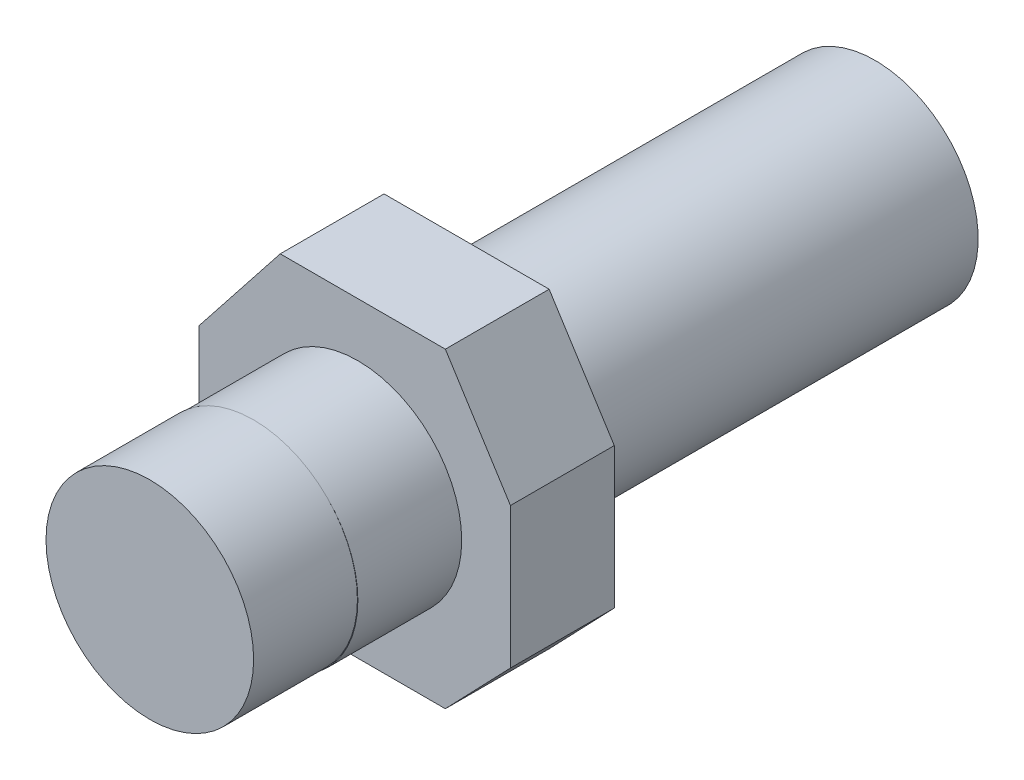
ISO-10303-21;
HEADER;
FILE_DESCRIPTION(('STEP AP214'),'2;1');
FILE_NAME('part.step','',(''),(''),'','','');
FILE_SCHEMA(('AUTOMOTIVE_DESIGN { 1 0 10303 214 1 1 1 1 }'));
ENDSEC;
DATA;
#1=APPLICATION_CONTEXT('core data for automotive mechanical design processes');
#2=APPLICATION_PROTOCOL_DEFINITION('international standard','automotive_design',2000,#1);
#3=PRODUCT_CONTEXT('',#1,'mechanical');
#4=PRODUCT('Part','Part','',(#3));
#5=PRODUCT_RELATED_PRODUCT_CATEGORY('part','',(#4));
#6=PRODUCT_DEFINITION_FORMATION('','',#4);
#7=PRODUCT_DEFINITION_CONTEXT('part definition',#1,'design');
#8=PRODUCT_DEFINITION('design','',#6,#7);
#9=PRODUCT_DEFINITION_SHAPE('','',#8);
#10=(LENGTH_UNIT() NAMED_UNIT(*) SI_UNIT(.MILLI.,.METRE.));
#11=(NAMED_UNIT(*) PLANE_ANGLE_UNIT() SI_UNIT($,.RADIAN.));
#12=(NAMED_UNIT(*) SI_UNIT($,.STERADIAN.) SOLID_ANGLE_UNIT());
#13=UNCERTAINTY_MEASURE_WITH_UNIT(LENGTH_MEASURE(1.E-05),#10,'distance_accuracy_value','');
#14=(GEOMETRIC_REPRESENTATION_CONTEXT(3) GLOBAL_UNCERTAINTY_ASSIGNED_CONTEXT((#13)) GLOBAL_UNIT_ASSIGNED_CONTEXT((#10,
#11,#12)) REPRESENTATION_CONTEXT('',''));
#15=CARTESIAN_POINT('',(0.,0.,0.));
#16=DIRECTION('',(0.,0.,1.));
#17=DIRECTION('',(1.,0.,0.));
#18=AXIS2_PLACEMENT_3D('',#15,#16,#17);
#19=CARTESIAN_POINT('',(-4.6073531721352,6.25797101449275,10.));
#20=DIRECTION('',(0.784882765533426,-0.61964428857902,0.));
#21=DIRECTION('',(0.61964428857902,0.784882765533426,0.));
#22=AXIS2_PLACEMENT_3D('',#19,#20,#21);
#23=PLANE('',#22);
#24=DIRECTION('',(-0.61964428857902,-0.784882765533426,0.));
#25=VECTOR('',#24,1.);
#26=CARTESIAN_POINT('',(-4.6073531721352,6.25797101449275,0.));
#27=LINE('',#26,#25);
#28=CARTESIAN_POINT('',(3.21511059598073,16.1664251207729,0.));
#29=VERTEX_POINT('',#28);
#30=CARTESIAN_POINT('',(-4.6073531721352,6.25797101449275,0.));
#31=VERTEX_POINT('',#30);
#32=EDGE_CURVE('E143',#29,#31,#27,.T.);
#33=ORIENTED_EDGE('',*,*,#32,.T.);
#34=DIRECTION('',(0.,0.,-1.));
#35=VECTOR('',#34,1.);
#36=CARTESIAN_POINT('',(-4.6073531721352,6.25797101449275,10.));
#37=LINE('',#36,#35);
#38=CARTESIAN_POINT('',(-4.6073531721352,6.25797101449275,10.));
#39=VERTEX_POINT('',#38);
#40=EDGE_CURVE('E39',#39,#31,#37,.T.);
#41=ORIENTED_EDGE('',*,*,#40,.F.);
#42=DIRECTION('',(-0.61964428857902,-0.784882765533426,0.));
#43=VECTOR('',#42,1.);
#44=CARTESIAN_POINT('',(-4.6073531721352,6.25797101449275,10.));
#45=LINE('',#44,#43);
#46=CARTESIAN_POINT('',(3.21511059598073,16.1664251207729,10.));
#47=VERTEX_POINT('',#46);
#48=EDGE_CURVE('E159',#47,#39,#45,.T.);
#49=ORIENTED_EDGE('',*,*,#48,.F.);
#50=DIRECTION('',(0.,0.,-1.));
#51=VECTOR('',#50,1.);
#52=CARTESIAN_POINT('',(3.21511059598073,16.1664251207729,10.));
#53=LINE('',#52,#51);
#54=EDGE_CURVE('E139',#47,#29,#53,.T.);
#55=ORIENTED_EDGE('',*,*,#54,.T.);
#56=EDGE_LOOP('',(#33,#41,#49,#55));
#57=FACE_BOUND('',#56,.T.);
#58=ADVANCED_FACE('F36',(#57),#23,.F.);
#59=CARTESIAN_POINT('',(-4.6073531721352,-7.30096618357487,10.));
#60=DIRECTION('',(1.,0.,0.));
#61=DIRECTION('',(0.,0.,-1.));
#62=AXIS2_PLACEMENT_3D('',#59,#60,#61);
#63=PLANE('',#62);
#64=DIRECTION('',(0.,-1.,0.));
#65=VECTOR('',#64,1.);
#66=CARTESIAN_POINT('',(-4.6073531721352,-7.30096618357487,0.));
#67=LINE('',#66,#65);
#68=CARTESIAN_POINT('',(-4.6073531721352,-7.30096618357487,0.));
#69=VERTEX_POINT('',#68);
#70=EDGE_CURVE('E146',#31,#69,#67,.T.);
#71=ORIENTED_EDGE('',*,*,#70,.T.);
#72=DIRECTION('',(0.,0.,-1.));
#73=VECTOR('',#72,1.);
#74=CARTESIAN_POINT('',(-4.6073531721352,-7.30096618357487,10.));
#75=LINE('',#74,#73);
#76=CARTESIAN_POINT('',(-4.6073531721352,-7.30096618357487,10.));
#77=VERTEX_POINT('',#76);
#78=EDGE_CURVE('E168',#77,#69,#75,.T.);
#79=ORIENTED_EDGE('',*,*,#78,.F.);
#80=DIRECTION('',(0.,-1.,0.));
#81=VECTOR('',#80,1.);
#82=CARTESIAN_POINT('',(-4.6073531721352,-7.30096618357487,10.));
#83=LINE('',#82,#81);
#84=EDGE_CURVE('E101',#39,#77,#83,.T.);
#85=ORIENTED_EDGE('',*,*,#84,.F.);
#86=ORIENTED_EDGE('',*,*,#40,.T.);
#87=EDGE_LOOP('',(#71,#79,#85,#86));
#88=FACE_BOUND('',#87,.T.);
#89=ADVANCED_FACE('F203',(#88),#63,.F.);
#90=CARTESIAN_POINT('',(3.21511059598073,-13.8335748792271,10.));
#91=DIRECTION('',(0.64098832210659,0.767550630853092,0.));
#92=DIRECTION('',(-0.767550630853092,0.64098832210659,0.));
#93=AXIS2_PLACEMENT_3D('',#90,#91,#92);
#94=PLANE('',#93);
#95=DIRECTION('',(0.767550630853091,-0.64098832210659,0.));
#96=VECTOR('',#95,1.);
#97=CARTESIAN_POINT('',(3.21511059598073,-13.8335748792271,0.));
#98=LINE('',#97,#96);
#99=CARTESIAN_POINT('',(3.21511059598073,-13.8335748792271,0.));
#100=VERTEX_POINT('',#99);
#101=EDGE_CURVE('E149',#69,#100,#98,.T.);
#102=ORIENTED_EDGE('',*,*,#101,.T.);
#103=DIRECTION('',(0.,0.,-1.));
#104=VECTOR('',#103,1.);
#105=CARTESIAN_POINT('',(3.21511059598073,-13.8335748792271,10.));
#106=LINE('',#105,#104);
#107=CARTESIAN_POINT('',(3.21511059598073,-13.8335748792271,10.));
#108=VERTEX_POINT('',#107);
#109=EDGE_CURVE('E166',#108,#100,#106,.T.);
#110=ORIENTED_EDGE('',*,*,#109,.F.);
#111=DIRECTION('',(0.767550630853091,-0.64098832210659,0.));
#112=VECTOR('',#111,1.);
#113=CARTESIAN_POINT('',(3.21511059598073,-13.8335748792271,10.));
#114=LINE('',#113,#112);
#115=EDGE_CURVE('E185',#77,#108,#114,.T.);
#116=ORIENTED_EDGE('',*,*,#115,.F.);
#117=ORIENTED_EDGE('',*,*,#78,.T.);
#118=EDGE_LOOP('',(#102,#110,#116,#117));
#119=FACE_BOUND('',#118,.T.);
#120=ADVANCED_FACE('F204',(#119),#94,.F.);
#121=CARTESIAN_POINT('',(19.1207869244832,-13.8335748792271,10.));
#122=DIRECTION('',(0.,1.,0.));
#123=DIRECTION('',(0.,0.,1.));
#124=AXIS2_PLACEMENT_3D('',#121,#122,#123);
#125=PLANE('',#124);
#126=DIRECTION('',(1.,0.,0.));
#127=VECTOR('',#126,1.);
#128=CARTESIAN_POINT('',(19.1207869244832,-13.8335748792271,0.));
#129=LINE('',#128,#127);
#130=CARTESIAN_POINT('',(19.1207869244832,-13.8335748792271,0.));
#131=VERTEX_POINT('',#130);
#132=EDGE_CURVE('E151',#100,#131,#129,.T.);
#133=ORIENTED_EDGE('',*,*,#132,.T.);
#134=DIRECTION('',(0.,0.,-1.));
#135=VECTOR('',#134,1.);
#136=CARTESIAN_POINT('',(19.1207869244832,-13.8335748792271,10.));
#137=LINE('',#136,#135);
#138=CARTESIAN_POINT('',(19.1207869244832,-13.8335748792271,10.));
#139=VERTEX_POINT('',#138);
#140=EDGE_CURVE('E163',#139,#131,#137,.T.);
#141=ORIENTED_EDGE('',*,*,#140,.F.);
#142=DIRECTION('',(1.,0.,0.));
#143=VECTOR('',#142,1.);
#144=CARTESIAN_POINT('',(19.1207869244832,-13.8335748792271,10.));
#145=LINE('',#144,#143);
#146=EDGE_CURVE('E187',#108,#139,#145,.T.);
#147=ORIENTED_EDGE('',*,*,#146,.F.);
#148=ORIENTED_EDGE('',*,*,#109,.T.);
#149=EDGE_LOOP('',(#133,#141,#147,#148));
#150=FACE_BOUND('',#149,.T.);
#151=ADVANCED_FACE('F192',(#150),#125,.F.);
#152=CARTESIAN_POINT('',(25.3926468278648,-7.30096618357487,10.));
#153=DIRECTION('',(-0.721356672535713,0.692563752291588,0.));
#154=DIRECTION('',(-0.692563752291588,-0.721356672535713,0.));
#155=AXIS2_PLACEMENT_3D('',#152,#153,#154);
#156=PLANE('',#155);
#157=DIRECTION('',(0.692563752291588,0.721356672535713,0.));
#158=VECTOR('',#157,1.);
#159=CARTESIAN_POINT('',(25.3926468278648,-7.30096618357487,0.));
#160=LINE('',#159,#158);
#161=CARTESIAN_POINT('',(25.3926468278648,-7.30096618357487,0.));
#162=VERTEX_POINT('',#161);
#163=EDGE_CURVE('E153',#131,#162,#160,.T.);
#164=ORIENTED_EDGE('',*,*,#163,.T.);
#165=DIRECTION('',(0.,0.,-1.));
#166=VECTOR('',#165,1.);
#167=CARTESIAN_POINT('',(25.3926468278648,-7.30096618357487,10.));
#168=LINE('',#167,#166);
#169=CARTESIAN_POINT('',(25.3926468278648,-7.30096618357487,10.));
#170=VERTEX_POINT('',#169);
#171=EDGE_CURVE('E134',#170,#162,#168,.T.);
#172=ORIENTED_EDGE('',*,*,#171,.F.);
#173=DIRECTION('',(0.692563752291588,0.721356672535713,0.));
#174=VECTOR('',#173,1.);
#175=CARTESIAN_POINT('',(25.3926468278648,-7.30096618357487,10.));
#176=LINE('',#175,#174);
#177=EDGE_CURVE('E122',#139,#170,#176,.T.);
#178=ORIENTED_EDGE('',*,*,#177,.F.);
#179=ORIENTED_EDGE('',*,*,#140,.T.);
#180=EDGE_LOOP('',(#164,#172,#178,#179));
#181=FACE_BOUND('',#180,.T.);
#182=ADVANCED_FACE('F196',(#181),#156,.F.);
#183=CARTESIAN_POINT('',(25.3926468278648,6.25797101449275,10.));
#184=DIRECTION('',(-1.,0.,0.));
#185=DIRECTION('',(0.,0.,1.));
#186=AXIS2_PLACEMENT_3D('',#183,#184,#185);
#187=PLANE('',#186);
#188=DIRECTION('',(0.,1.,0.));
#189=VECTOR('',#188,1.);
#190=CARTESIAN_POINT('',(25.3926468278648,6.25797101449275,0.));
#191=LINE('',#190,#189);
#192=CARTESIAN_POINT('',(25.3926468278648,6.25797101449275,0.));
#193=VERTEX_POINT('',#192);
#194=EDGE_CURVE('E131',#162,#193,#191,.T.);
#195=ORIENTED_EDGE('',*,*,#194,.T.);
#196=DIRECTION('',(0.,0.,-1.));
#197=VECTOR('',#196,1.);
#198=CARTESIAN_POINT('',(25.3926468278648,6.25797101449275,10.));
#199=LINE('',#198,#197);
#200=CARTESIAN_POINT('',(25.3926468278648,6.25797101449275,10.));
#201=VERTEX_POINT('',#200);
#202=EDGE_CURVE('E128',#201,#193,#199,.T.);
#203=ORIENTED_EDGE('',*,*,#202,.F.);
#204=DIRECTION('',(0.,1.,0.));
#205=VECTOR('',#204,1.);
#206=CARTESIAN_POINT('',(25.3926468278648,6.25797101449275,10.));
#207=LINE('',#206,#205);
#208=EDGE_CURVE('E115',#170,#201,#207,.T.);
#209=ORIENTED_EDGE('',*,*,#208,.F.);
#210=ORIENTED_EDGE('',*,*,#171,.T.);
#211=EDGE_LOOP('',(#195,#203,#209,#210));
#212=FACE_BOUND('',#211,.T.);
#213=ADVANCED_FACE('F129',(#212),#187,.F.);
#214=CARTESIAN_POINT('',(19.1207869244832,16.1664251207729,10.));
#215=DIRECTION('',(-0.844953744857486,-0.534839386219181,0.));
#216=DIRECTION('',(0.534839386219181,-0.844953744857486,0.));
#217=AXIS2_PLACEMENT_3D('',#214,#215,#216);
#218=PLANE('',#217);
#219=DIRECTION('',(-0.534839386219181,0.844953744857486,0.));
#220=VECTOR('',#219,1.);
#221=CARTESIAN_POINT('',(19.1207869244832,16.1664251207729,0.));
#222=LINE('',#221,#220);
#223=CARTESIAN_POINT('',(19.1207869244832,16.1664251207729,0.));
#224=VERTEX_POINT('',#223);
#225=EDGE_CURVE('E156',#193,#224,#222,.T.);
#226=ORIENTED_EDGE('',*,*,#225,.T.);
#227=DIRECTION('',(0.,0.,-1.));
#228=VECTOR('',#227,1.);
#229=CARTESIAN_POINT('',(19.1207869244832,16.1664251207729,10.));
#230=LINE('',#229,#228);
#231=CARTESIAN_POINT('',(19.1207869244832,16.1664251207729,10.));
#232=VERTEX_POINT('',#231);
#233=EDGE_CURVE('E135',#232,#224,#230,.T.);
#234=ORIENTED_EDGE('',*,*,#233,.F.);
#235=DIRECTION('',(-0.534839386219181,0.844953744857486,0.));
#236=VECTOR('',#235,1.);
#237=CARTESIAN_POINT('',(19.1207869244832,16.1664251207729,10.));
#238=LINE('',#237,#236);
#239=EDGE_CURVE('E119',#201,#232,#238,.T.);
#240=ORIENTED_EDGE('',*,*,#239,.F.);
#241=ORIENTED_EDGE('',*,*,#202,.T.);
#242=EDGE_LOOP('',(#226,#234,#240,#241));
#243=FACE_BOUND('',#242,.T.);
#244=ADVANCED_FACE('F137',(#243),#218,.F.);
#245=CARTESIAN_POINT('',(3.21511059598073,16.1664251207729,10.));
#246=DIRECTION('',(0.,-1.,0.));
#247=DIRECTION('',(0.,0.,-1.));
#248=AXIS2_PLACEMENT_3D('',#245,#246,#247);
#249=PLANE('',#248);
#250=DIRECTION('',(-1.,0.,0.));
#251=VECTOR('',#250,1.);
#252=CARTESIAN_POINT('',(3.21511059598073,16.1664251207729,0.));
#253=LINE('',#252,#251);
#254=EDGE_CURVE('E92',#224,#29,#253,.T.);
#255=ORIENTED_EDGE('',*,*,#254,.T.);
#256=ORIENTED_EDGE('',*,*,#54,.F.);
#257=DIRECTION('',(-1.,0.,0.));
#258=VECTOR('',#257,1.);
#259=CARTESIAN_POINT('',(3.21511059598073,16.1664251207729,10.));
#260=LINE('',#259,#258);
#261=EDGE_CURVE('E59',#232,#47,#260,.T.);
#262=ORIENTED_EDGE('',*,*,#261,.F.);
#263=ORIENTED_EDGE('',*,*,#233,.T.);
#264=EDGE_LOOP('',(#255,#256,#262,#263));
#265=FACE_BOUND('',#264,.T.);
#266=ADVANCED_FACE('F200',(#265),#249,.F.);
#267=CARTESIAN_POINT('',(0.,0.,10.));
#268=DIRECTION('',(0.,0.,1.));
#269=DIRECTION('',(1.,0.,0.));
#270=AXIS2_PLACEMENT_3D('',#267,#268,#269);
#271=PLANE('',#270);
#272=CARTESIAN_POINT('',(10.6958651656435,0.993157499185136,10.));
#273=DIRECTION('',(0.,0.,1.));
#274=DIRECTION('',(1.,0.,0.));
#275=AXIS2_PLACEMENT_3D('',#272,#273,#274);
#276=CIRCLE('',#275,10.);
#277=CARTESIAN_POINT('',(20.6958651656435,0.993157499185136,10.));
#278=VERTEX_POINT('',#277);
#279=EDGE_CURVE('E173',#278,#278,#276,.T.);
#280=ORIENTED_EDGE('',*,*,#279,.F.);
#281=EDGE_LOOP('',(#280));
#282=FACE_BOUND('',#281,.T.);
#283=ORIENTED_EDGE('',*,*,#48,.T.);
#284=ORIENTED_EDGE('',*,*,#84,.T.);
#285=ORIENTED_EDGE('',*,*,#115,.T.);
#286=ORIENTED_EDGE('',*,*,#146,.T.);
#287=ORIENTED_EDGE('',*,*,#177,.T.);
#288=ORIENTED_EDGE('',*,*,#208,.T.);
#289=ORIENTED_EDGE('',*,*,#239,.T.);
#290=ORIENTED_EDGE('',*,*,#261,.T.);
#291=EDGE_LOOP('',(#283,#284,#285,#286,#287,#288,#289,#290));
#292=FACE_BOUND('',#291,.T.);
#293=ADVANCED_FACE('F117',(#282,#292),#271,.T.);
#294=CARTESIAN_POINT('',(0.,0.,0.));
#295=DIRECTION('',(0.,0.,1.));
#296=DIRECTION('',(1.,0.,0.));
#297=AXIS2_PLACEMENT_3D('',#294,#295,#296);
#298=PLANE('',#297);
#299=CARTESIAN_POINT('',(10.5225975440556,1.03647440458196,0.));
#300=DIRECTION('',(0.,0.,-1.));
#301=DIRECTION('',(-1.,0.,0.));
#302=AXIS2_PLACEMENT_3D('',#299,#300,#301);
#303=CIRCLE('',#302,9.92496084036597);
#304=CARTESIAN_POINT('',(0.59763670368959,1.03647440458196,0.));
#305=VERTEX_POINT('',#304);
#306=EDGE_CURVE('E11',#305,#305,#303,.T.);
#307=ORIENTED_EDGE('',*,*,#306,.F.);
#308=EDGE_LOOP('',(#307));
#309=FACE_BOUND('',#308,.T.);
#310=ORIENTED_EDGE('',*,*,#32,.F.);
#311=ORIENTED_EDGE('',*,*,#254,.F.);
#312=ORIENTED_EDGE('',*,*,#225,.F.);
#313=ORIENTED_EDGE('',*,*,#194,.F.);
#314=ORIENTED_EDGE('',*,*,#163,.F.);
#315=ORIENTED_EDGE('',*,*,#132,.F.);
#316=ORIENTED_EDGE('',*,*,#101,.F.);
#317=ORIENTED_EDGE('',*,*,#70,.F.);
#318=EDGE_LOOP('',(#310,#311,#312,#313,#314,#315,#316,#317));
#319=FACE_BOUND('',#318,.T.);
#320=ADVANCED_FACE('F199',(#309,#319),#298,.F.);
#321=CARTESIAN_POINT('',(10.6958651656435,0.993157499185136,20.));
#322=DIRECTION('',(0.,0.,-1.));
#323=DIRECTION('',(-1.,0.,0.));
#324=AXIS2_PLACEMENT_3D('',#321,#322,#323);
#325=CYLINDRICAL_SURFACE('',#324,10.);
#326=CARTESIAN_POINT('',(10.6958651656435,0.993157499185136,20.));
#327=DIRECTION('',(0.,0.,1.));
#328=DIRECTION('',(1.,0.,0.));
#329=AXIS2_PLACEMENT_3D('',#326,#327,#328);
#330=CIRCLE('',#329,10.);
#331=CARTESIAN_POINT('',(17.7452413551635,8.08585059409835,20.));
#332=VERTEX_POINT('',#331);
#333=CARTESIAN_POINT('',(3.60317207072463,-6.05621869032908,20.));
#334=VERTEX_POINT('',#333);
#335=EDGE_CURVE('E147',#332,#334,#330,.T.);
#336=ORIENTED_EDGE('',*,*,#335,.F.);
#337=EDGE_CURVE('E360',#334,#332,#330,.T.);
#338=ORIENTED_EDGE('',*,*,#337,.F.);
#339=EDGE_LOOP('',(#336,#338));
#340=FACE_BOUND('',#339,.T.);
#341=ORIENTED_EDGE('',*,*,#279,.T.);
#342=EDGE_LOOP('',(#341));
#343=FACE_BOUND('',#342,.T.);
#344=ADVANCED_FACE('F277',(#340,#343),#325,.T.);
#345=CARTESIAN_POINT('',(10.6958651656435,0.993157499185136,20.));
#346=DIRECTION('',(0.,0.,1.));
#347=DIRECTION('',(1.,0.,0.));
#348=AXIS2_PLACEMENT_3D('',#345,#346,#347);
#349=PLANE('',#348);
#350=CARTESIAN_POINT('',(10.6525482602466,1.03647440458213,20.));
#351=DIRECTION('',(0.,0.,1.));
#352=DIRECTION('',(1.,0.,0.));
#353=AXIS2_PLACEMENT_3D('',#350,#351,#352);
#354=CIRCLE('',#353,10.);
#355=EDGE_CURVE('E44',#334,#332,#354,.T.);
#356=ORIENTED_EDGE('',*,*,#355,.F.);
#357=ORIENTED_EDGE('',*,*,#337,.T.);
#358=EDGE_LOOP('',(#356,#357));
#359=FACE_BOUND('',#358,.T.);
#360=ADVANCED_FACE('F282',(#359),#349,.T.);
#361=CARTESIAN_POINT('',(10.6525482602466,1.03647440458213,20.));
#362=DIRECTION('',(0.,0.,1.));
#363=DIRECTION('',(1.,0.,0.));
#364=AXIS2_PLACEMENT_3D('',#361,#362,#363);
#365=PLANE('',#364);
#366=EDGE_CURVE('E180',#332,#334,#354,.T.);
#367=ORIENTED_EDGE('',*,*,#366,.F.);
#368=ORIENTED_EDGE('',*,*,#335,.T.);
#369=EDGE_LOOP('',(#367,#368));
#370=FACE_BOUND('',#369,.T.);
#371=ADVANCED_FACE('F292',(#370),#365,.F.);
#372=CARTESIAN_POINT('',(10.6525482602466,1.03647440458213,30.));
#373=DIRECTION('',(0.,0.,-1.));
#374=DIRECTION('',(-1.,0.,0.));
#375=AXIS2_PLACEMENT_3D('',#372,#373,#374);
#376=CYLINDRICAL_SURFACE('',#375,10.);
#377=CARTESIAN_POINT('',(10.6525482602466,1.03647440458213,30.));
#378=DIRECTION('',(0.,0.,1.));
#379=DIRECTION('',(1.,0.,0.));
#380=AXIS2_PLACEMENT_3D('',#377,#378,#379);
#381=CIRCLE('',#380,10.);
#382=CARTESIAN_POINT('',(20.6525482602466,1.03647440458213,30.));
#383=VERTEX_POINT('',#382);
#384=EDGE_CURVE('E357',#383,#383,#381,.T.);
#385=ORIENTED_EDGE('',*,*,#384,.F.);
#386=EDGE_LOOP('',(#385));
#387=FACE_BOUND('',#386,.T.);
#388=ORIENTED_EDGE('',*,*,#366,.T.);
#389=ORIENTED_EDGE('',*,*,#355,.T.);
#390=EDGE_LOOP('',(#388,#389));
#391=FACE_BOUND('',#390,.T.);
#392=ADVANCED_FACE('F301',(#387,#391),#376,.T.);
#393=CARTESIAN_POINT('',(10.6525482602466,1.03647440458213,30.));
#394=DIRECTION('',(0.,0.,1.));
#395=DIRECTION('',(1.,0.,0.));
#396=AXIS2_PLACEMENT_3D('',#393,#394,#395);
#397=PLANE('',#396);
#398=ORIENTED_EDGE('',*,*,#384,.T.);
#399=EDGE_LOOP('',(#398));
#400=FACE_BOUND('',#399,.T.);
#401=ADVANCED_FACE('F311',(#400),#397,.T.);
#402=CARTESIAN_POINT('',(10.5225975440556,1.03647440458196,-40.));
#403=DIRECTION('',(0.,0.,1.));
#404=DIRECTION('',(1.,0.,0.));
#405=AXIS2_PLACEMENT_3D('',#402,#403,#404);
#406=CYLINDRICAL_SURFACE('',#405,9.92496084036597);
#407=CARTESIAN_POINT('',(10.5225975440556,1.03647440458196,-40.));
#408=DIRECTION('',(0.,0.,-1.));
#409=DIRECTION('',(-1.,0.,0.));
#410=AXIS2_PLACEMENT_3D('',#407,#408,#409);
#411=CIRCLE('',#410,9.92496084036597);
#412=CARTESIAN_POINT('',(0.59763670368959,1.03647440458196,-40.));
#413=VERTEX_POINT('',#412);
#414=EDGE_CURVE('E354',#413,#413,#411,.T.);
#415=ORIENTED_EDGE('',*,*,#414,.F.);
#416=EDGE_LOOP('',(#415));
#417=FACE_BOUND('',#416,.T.);
#418=ORIENTED_EDGE('',*,*,#306,.T.);
#419=EDGE_LOOP('',(#418));
#420=FACE_BOUND('',#419,.T.);
#421=ADVANCED_FACE('F321',(#417,#420),#406,.T.);
#422=CARTESIAN_POINT('',(10.5225975440556,1.03647440458196,-40.));
#423=DIRECTION('',(0.,0.,-1.));
#424=DIRECTION('',(-1.,0.,0.));
#425=AXIS2_PLACEMENT_3D('',#422,#423,#424);
#426=PLANE('',#425);
#427=ORIENTED_EDGE('',*,*,#414,.T.);
#428=EDGE_LOOP('',(#427));
#429=FACE_BOUND('',#428,.T.);
#430=ADVANCED_FACE('F338',(#429),#426,.T.);
#431=CLOSED_SHELL('',(#58,#89,#120,#151,#182,#213,#244,#266,#293,#320,#344,#360,#371,#392,#401,
#421,#430));
#432=MANIFOLD_SOLID_BREP('B2',#431);
#433=ADVANCED_BREP_SHAPE_REPRESENTATION('',(#18,#432),#14);
#434=SHAPE_DEFINITION_REPRESENTATION(#9,#433);
ENDSEC;
END-ISO-10303-21;
